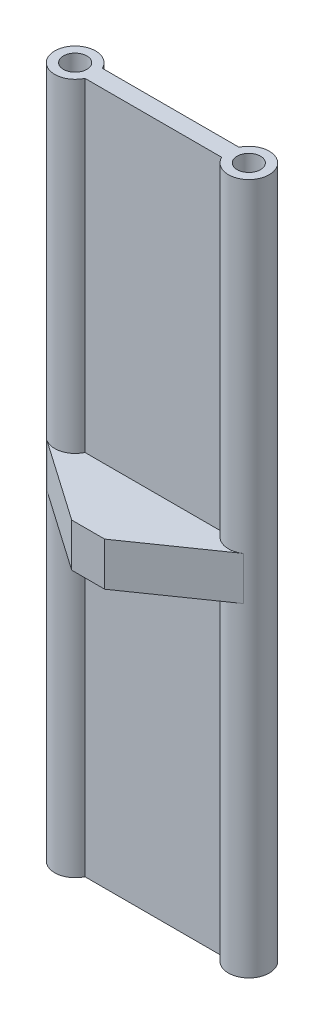
ISO-10303-21;
HEADER;
FILE_DESCRIPTION(('STEP AP214'),'2;1');
FILE_NAME('part.step','',(''),(''),'','','');
FILE_SCHEMA(('AUTOMOTIVE_DESIGN { 1 0 10303 214 1 1 1 1 }'));
ENDSEC;
DATA;
#1=APPLICATION_CONTEXT('core data for automotive mechanical design processes');
#2=APPLICATION_PROTOCOL_DEFINITION('international standard','automotive_design',2000,#1);
#3=PRODUCT_CONTEXT('',#1,'mechanical');
#4=PRODUCT('Part','Part','',(#3));
#5=PRODUCT_RELATED_PRODUCT_CATEGORY('part','',(#4));
#6=PRODUCT_DEFINITION_FORMATION('','',#4);
#7=PRODUCT_DEFINITION_CONTEXT('part definition',#1,'design');
#8=PRODUCT_DEFINITION('design','',#6,#7);
#9=PRODUCT_DEFINITION_SHAPE('','',#8);
#10=(LENGTH_UNIT() NAMED_UNIT(*) SI_UNIT(.MILLI.,.METRE.));
#11=(NAMED_UNIT(*) PLANE_ANGLE_UNIT() SI_UNIT($,.RADIAN.));
#12=(NAMED_UNIT(*) SI_UNIT($,.STERADIAN.) SOLID_ANGLE_UNIT());
#13=UNCERTAINTY_MEASURE_WITH_UNIT(LENGTH_MEASURE(1.E-05),#10,'distance_accuracy_value','');
#14=(GEOMETRIC_REPRESENTATION_CONTEXT(3) GLOBAL_UNCERTAINTY_ASSIGNED_CONTEXT((#13)) GLOBAL_UNIT_ASSIGNED_CONTEXT((#10,
#11,#12)) REPRESENTATION_CONTEXT('',''));
#15=CARTESIAN_POINT('',(0.,0.,0.));
#16=DIRECTION('',(0.,0.,1.));
#17=DIRECTION('',(1.,0.,0.));
#18=AXIS2_PLACEMENT_3D('',#15,#16,#17);
#19=CARTESIAN_POINT('',(19.9983927391933,202.2602,2.54));
#20=DIRECTION('',(0.,0.,-1.));
#21=DIRECTION('',(-1.,0.,0.));
#22=AXIS2_PLACEMENT_3D('',#19,#20,#21);
#23=PLANE('',#22);
#24=DIRECTION('',(-1.,0.,0.));
#25=VECTOR('',#24,1.);
#26=CARTESIAN_POINT('',(-19.9983927391933,94.7801,2.54));
#27=LINE('',#26,#25);
#28=CARTESIAN_POINT('',(19.9983927391933,94.7801,2.54));
#29=VERTEX_POINT('',#28);
#30=CARTESIAN_POINT('',(-19.9983927391933,94.7801,2.54));
#31=VERTEX_POINT('',#30);
#32=EDGE_CURVE('E151',#29,#31,#27,.T.);
#33=ORIENTED_EDGE('',*,*,#32,.T.);
#34=DIRECTION('',(0.,-1.,0.));
#35=VECTOR('',#34,1.);
#36=CARTESIAN_POINT('',(-19.9983927391933,202.2602,2.54));
#37=LINE('',#36,#35);
#38=CARTESIAN_POINT('',(-19.9983927391933,0.,2.54));
#39=VERTEX_POINT('',#38);
#40=EDGE_CURVE('E273',#31,#39,#37,.T.);
#41=ORIENTED_EDGE('',*,*,#40,.T.);
#42=DIRECTION('',(1.,0.,0.));
#43=VECTOR('',#42,1.);
#44=CARTESIAN_POINT('',(19.9983927391933,0.,2.54));
#45=LINE('',#44,#43);
#46=CARTESIAN_POINT('',(19.9983927391933,0.,2.54));
#47=VERTEX_POINT('',#46);
#48=EDGE_CURVE('E154',#39,#47,#45,.T.);
#49=ORIENTED_EDGE('',*,*,#48,.T.);
#50=DIRECTION('',(0.,-1.,0.));
#51=VECTOR('',#50,1.);
#52=CARTESIAN_POINT('',(19.9983927391933,202.2602,2.54));
#53=LINE('',#52,#51);
#54=EDGE_CURVE('E149',#29,#47,#53,.T.);
#55=ORIENTED_EDGE('',*,*,#54,.F.);
#56=EDGE_LOOP('',(#33,#41,#49,#55));
#57=FACE_BOUND('',#56,.T.);
#58=ADVANCED_FACE('F37',(#57),#23,.F.);
#59=CARTESIAN_POINT('',(19.9983927391933,202.2602,-2.54));
#60=DIRECTION('',(0.,0.,1.));
#61=DIRECTION('',(1.,0.,0.));
#62=AXIS2_PLACEMENT_3D('',#59,#60,#61);
#63=PLANE('',#62);
#64=DIRECTION('',(1.,0.,0.));
#65=VECTOR('',#64,1.);
#66=CARTESIAN_POINT('',(19.9983927391933,94.7801,-2.54));
#67=LINE('',#66,#65);
#68=CARTESIAN_POINT('',(-19.9983927391933,94.7801,-2.54));
#69=VERTEX_POINT('',#68);
#70=CARTESIAN_POINT('',(19.9983927391933,94.7801,-2.54));
#71=VERTEX_POINT('',#70);
#72=EDGE_CURVE('E209',#69,#71,#67,.T.);
#73=ORIENTED_EDGE('',*,*,#72,.T.);
#74=DIRECTION('',(0.,-1.,0.));
#75=VECTOR('',#74,1.);
#76=CARTESIAN_POINT('',(19.9983927391933,202.2602,-2.54));
#77=LINE('',#76,#75);
#78=CARTESIAN_POINT('',(19.9983927391933,0.,-2.54));
#79=VERTEX_POINT('',#78);
#80=EDGE_CURVE('E45',#71,#79,#77,.T.);
#81=ORIENTED_EDGE('',*,*,#80,.T.);
#82=DIRECTION('',(-1.,0.,0.));
#83=VECTOR('',#82,1.);
#84=CARTESIAN_POINT('',(19.9983927391933,0.,-2.54));
#85=LINE('',#84,#83);
#86=CARTESIAN_POINT('',(-19.9983927391933,0.,-2.54));
#87=VERTEX_POINT('',#86);
#88=EDGE_CURVE('E266',#79,#87,#85,.T.);
#89=ORIENTED_EDGE('',*,*,#88,.T.);
#90=DIRECTION('',(0.,-1.,0.));
#91=VECTOR('',#90,1.);
#92=CARTESIAN_POINT('',(-19.9983927391933,202.2602,-2.54));
#93=LINE('',#92,#91);
#94=EDGE_CURVE('E276',#69,#87,#93,.T.);
#95=ORIENTED_EDGE('',*,*,#94,.F.);
#96=EDGE_LOOP('',(#73,#81,#89,#95));
#97=FACE_BOUND('',#96,.T.);
#98=ADVANCED_FACE('F289',(#97),#63,.F.);
#99=CARTESIAN_POINT('',(25.4,202.2602,0.));
#100=DIRECTION('',(0.,1.,0.));
#101=DIRECTION('',(0.,0.,1.));
#102=AXIS2_PLACEMENT_3D('',#99,#100,#101);
#103=PLANE('',#102);
#104=CARTESIAN_POINT('',(-25.4,202.2602,0.));
#105=DIRECTION('',(0.,1.,0.));
#106=DIRECTION('',(0.,0.,1.));
#107=AXIS2_PLACEMENT_3D('',#104,#105,#106);
#108=CIRCLE('',#107,3.429);
#109=CARTESIAN_POINT('',(-25.4,202.2602,3.42900000000001));
#110=VERTEX_POINT('',#109);
#111=EDGE_CURVE('E251',#110,#110,#108,.T.);
#112=ORIENTED_EDGE('',*,*,#111,.F.);
#113=EDGE_LOOP('',(#112));
#114=FACE_BOUND('',#113,.T.);
#115=CARTESIAN_POINT('',(25.4,202.2602,0.));
#116=DIRECTION('',(0.,1.,0.));
#117=DIRECTION('',(0.,0.,1.));
#118=AXIS2_PLACEMENT_3D('',#115,#116,#117);
#119=CIRCLE('',#118,5.969);
#120=CARTESIAN_POINT('',(19.9983927391933,202.2602,2.54));
#121=VERTEX_POINT('',#120);
#122=CARTESIAN_POINT('',(19.9983927391933,202.2602,-2.54));
#123=VERTEX_POINT('',#122);
#124=EDGE_CURVE('E257',#121,#123,#119,.T.);
#125=ORIENTED_EDGE('',*,*,#124,.T.);
#126=DIRECTION('',(-1.,0.,0.));
#127=VECTOR('',#126,1.);
#128=CARTESIAN_POINT('',(19.9983927391933,202.2602,-2.54));
#129=LINE('',#128,#127);
#130=CARTESIAN_POINT('',(-19.9983927391933,202.2602,-2.54));
#131=VERTEX_POINT('',#130);
#132=EDGE_CURVE('E260',#123,#131,#129,.T.);
#133=ORIENTED_EDGE('',*,*,#132,.T.);
#134=CARTESIAN_POINT('',(-25.4,202.2602,0.));
#135=DIRECTION('',(0.,1.,0.));
#136=DIRECTION('',(0.,0.,1.));
#137=AXIS2_PLACEMENT_3D('',#134,#135,#136);
#138=CIRCLE('',#137,5.969);
#139=CARTESIAN_POINT('',(-19.9983927391933,202.2602,2.54));
#140=VERTEX_POINT('',#139);
#141=EDGE_CURVE('E262',#131,#140,#138,.T.);
#142=ORIENTED_EDGE('',*,*,#141,.T.);
#143=DIRECTION('',(1.,0.,0.));
#144=VECTOR('',#143,1.);
#145=CARTESIAN_POINT('',(19.9983927391933,202.2602,2.54));
#146=LINE('',#145,#144);
#147=EDGE_CURVE('E158',#140,#121,#146,.T.);
#148=ORIENTED_EDGE('',*,*,#147,.T.);
#149=EDGE_LOOP('',(#125,#133,#142,#148));
#150=FACE_BOUND('',#149,.T.);
#151=CARTESIAN_POINT('',(25.4,202.2602,0.));
#152=DIRECTION('',(0.,1.,0.));
#153=DIRECTION('',(0.,0.,1.));
#154=AXIS2_PLACEMENT_3D('',#151,#152,#153);
#155=CIRCLE('',#154,3.429);
#156=CARTESIAN_POINT('',(25.4,202.2602,3.42900000000001));
#157=VERTEX_POINT('',#156);
#158=EDGE_CURVE('E245',#157,#157,#155,.T.);
#159=ORIENTED_EDGE('',*,*,#158,.F.);
#160=EDGE_LOOP('',(#159));
#161=FACE_BOUND('',#160,.T.);
#162=ADVANCED_FACE('F335',(#114,#150,#161),#103,.T.);
#163=CARTESIAN_POINT('',(25.4,0.,0.));
#164=DIRECTION('',(0.,1.,0.));
#165=DIRECTION('',(0.,0.,1.));
#166=AXIS2_PLACEMENT_3D('',#163,#164,#165);
#167=PLANE('',#166);
#168=CARTESIAN_POINT('',(25.4,0.,0.));
#169=DIRECTION('',(0.,1.,0.));
#170=DIRECTION('',(0.,0.,1.));
#171=AXIS2_PLACEMENT_3D('',#168,#169,#170);
#172=CIRCLE('',#171,5.969);
#173=EDGE_CURVE('E254',#47,#79,#172,.T.);
#174=ORIENTED_EDGE('',*,*,#173,.F.);
#175=ORIENTED_EDGE('',*,*,#48,.F.);
#176=CARTESIAN_POINT('',(-25.4,0.,0.));
#177=DIRECTION('',(0.,1.,0.));
#178=DIRECTION('',(0.,0.,1.));
#179=AXIS2_PLACEMENT_3D('',#176,#177,#178);
#180=CIRCLE('',#179,5.969);
#181=EDGE_CURVE('E269',#87,#39,#180,.T.);
#182=ORIENTED_EDGE('',*,*,#181,.F.);
#183=ORIENTED_EDGE('',*,*,#88,.F.);
#184=EDGE_LOOP('',(#174,#175,#182,#183));
#185=FACE_BOUND('',#184,.T.);
#186=CARTESIAN_POINT('',(-25.4,0.,0.));
#187=DIRECTION('',(0.,1.,0.));
#188=DIRECTION('',(0.,0.,1.));
#189=AXIS2_PLACEMENT_3D('',#186,#187,#188);
#190=CIRCLE('',#189,3.429);
#191=CARTESIAN_POINT('',(-25.4,0.,3.42900000000001));
#192=VERTEX_POINT('',#191);
#193=EDGE_CURVE('E248',#192,#192,#190,.T.);
#194=ORIENTED_EDGE('',*,*,#193,.T.);
#195=EDGE_LOOP('',(#194));
#196=FACE_BOUND('',#195,.T.);
#197=CARTESIAN_POINT('',(25.4,0.,0.));
#198=DIRECTION('',(0.,1.,0.));
#199=DIRECTION('',(0.,0.,1.));
#200=AXIS2_PLACEMENT_3D('',#197,#198,#199);
#201=CIRCLE('',#200,3.429);
#202=CARTESIAN_POINT('',(25.4,0.,3.42900000000001));
#203=VERTEX_POINT('',#202);
#204=EDGE_CURVE('E244',#203,#203,#201,.T.);
#205=ORIENTED_EDGE('',*,*,#204,.T.);
#206=EDGE_LOOP('',(#205));
#207=FACE_BOUND('',#206,.T.);
#208=ADVANCED_FACE('F292',(#185,#196,#207),#167,.F.);
#209=CARTESIAN_POINT('',(25.4,202.2602,0.));
#210=DIRECTION('',(0.,-1.,0.));
#211=DIRECTION('',(0.,0.,-1.));
#212=AXIS2_PLACEMENT_3D('',#209,#210,#211);
#213=CYLINDRICAL_SURFACE('',#212,5.969);
#214=CARTESIAN_POINT('',(19.9983927391933,107.4801,2.54));
#215=VERTEX_POINT('',#214);
#216=EDGE_CURVE('E157',#121,#215,#53,.T.);
#217=ORIENTED_EDGE('',*,*,#216,.T.);
#218=CARTESIAN_POINT('',(25.4,107.4801,0.));
#219=DIRECTION('',(0.,-1.,0.));
#220=DIRECTION('',(0.,0.,-1.));
#221=AXIS2_PLACEMENT_3D('',#218,#219,#220);
#222=CIRCLE('',#221,5.969);
#223=CARTESIAN_POINT('',(28.8095663889265,107.4801,4.89936914709464));
#224=VERTEX_POINT('',#223);
#225=EDGE_CURVE('E52',#224,#215,#222,.T.);
#226=ORIENTED_EDGE('',*,*,#225,.F.);
#227=DIRECTION('',(0.,-1.,0.));
#228=VECTOR('',#227,1.);
#229=CARTESIAN_POINT('',(28.8095663889265,107.4801,4.89936914709464));
#230=LINE('',#229,#228);
#231=CARTESIAN_POINT('',(28.8095663889265,94.7801,4.89936914709464));
#232=VERTEX_POINT('',#231);
#233=EDGE_CURVE('E56',#224,#232,#230,.T.);
#234=ORIENTED_EDGE('',*,*,#233,.T.);
#235=CARTESIAN_POINT('',(25.4,94.7801,0.));
#236=DIRECTION('',(0.,-1.,0.));
#237=DIRECTION('',(0.,0.,-1.));
#238=AXIS2_PLACEMENT_3D('',#235,#236,#237);
#239=CIRCLE('',#238,5.969);
#240=EDGE_CURVE('E160',#232,#29,#239,.T.);
#241=ORIENTED_EDGE('',*,*,#240,.T.);
#242=ORIENTED_EDGE('',*,*,#54,.T.);
#243=ORIENTED_EDGE('',*,*,#173,.T.);
#244=ORIENTED_EDGE('',*,*,#80,.F.);
#245=CARTESIAN_POINT('',(25.4,94.7801,0.));
#246=DIRECTION('',(0.,-1.,0.));
#247=DIRECTION('',(0.,0.,1.));
#248=AXIS2_PLACEMENT_3D('',#245,#246,#247);
#249=CIRCLE('',#248,5.969);
#250=CARTESIAN_POINT('',(28.8095663889265,94.7801,-4.89936914709464));
#251=VERTEX_POINT('',#250);
#252=EDGE_CURVE('E204',#71,#251,#249,.T.);
#253=ORIENTED_EDGE('',*,*,#252,.T.);
#254=DIRECTION('',(0.,-1.,0.));
#255=VECTOR('',#254,1.);
#256=CARTESIAN_POINT('',(28.8095663889265,107.4801,-4.89936914709464));
#257=LINE('',#256,#255);
#258=CARTESIAN_POINT('',(28.8095663889265,107.4801,-4.89936914709464));
#259=VERTEX_POINT('',#258);
#260=EDGE_CURVE('E241',#259,#251,#257,.T.);
#261=ORIENTED_EDGE('',*,*,#260,.F.);
#262=CARTESIAN_POINT('',(25.4,107.4801,0.));
#263=DIRECTION('',(0.,-1.,0.));
#264=DIRECTION('',(0.,0.,1.));
#265=AXIS2_PLACEMENT_3D('',#262,#263,#264);
#266=CIRCLE('',#265,5.969);
#267=CARTESIAN_POINT('',(19.9983927391933,107.4801,-2.54));
#268=VERTEX_POINT('',#267);
#269=EDGE_CURVE('E205',#268,#259,#266,.T.);
#270=ORIENTED_EDGE('',*,*,#269,.F.);
#271=EDGE_CURVE('E11',#123,#268,#77,.T.);
#272=ORIENTED_EDGE('',*,*,#271,.F.);
#273=ORIENTED_EDGE('',*,*,#124,.F.);
#274=EDGE_LOOP('',(#217,#226,#234,#241,#242,#243,#244,#253,#261,#270,#272,#273));
#275=FACE_BOUND('',#274,.T.);
#276=ADVANCED_FACE('F39',(#275),#213,.T.);
#277=ORIENTED_EDGE('',*,*,#271,.T.);
#278=DIRECTION('',(1.,0.,0.));
#279=VECTOR('',#278,1.);
#280=CARTESIAN_POINT('',(19.9983927391933,107.4801,-2.54));
#281=LINE('',#280,#279);
#282=CARTESIAN_POINT('',(-19.9983927391933,107.4801,-2.54));
#283=VERTEX_POINT('',#282);
#284=EDGE_CURVE('E219',#283,#268,#281,.T.);
#285=ORIENTED_EDGE('',*,*,#284,.F.);
#286=EDGE_CURVE('E277',#131,#283,#93,.T.);
#287=ORIENTED_EDGE('',*,*,#286,.F.);
#288=ORIENTED_EDGE('',*,*,#132,.F.);
#289=EDGE_LOOP('',(#277,#285,#287,#288));
#290=FACE_BOUND('',#289,.T.);
#291=ADVANCED_FACE('F308',(#290),#63,.F.);
#292=CARTESIAN_POINT('',(-25.4,202.2602,0.));
#293=DIRECTION('',(0.,-1.,0.));
#294=DIRECTION('',(0.,0.,-1.));
#295=AXIS2_PLACEMENT_3D('',#292,#293,#294);
#296=CYLINDRICAL_SURFACE('',#295,5.969);
#297=DIRECTION('',(0.,-1.,0.));
#298=VECTOR('',#297,1.);
#299=CARTESIAN_POINT('',(-28.8095663889265,107.4801,4.89936914709464));
#300=LINE('',#299,#298);
#301=CARTESIAN_POINT('',(-28.8095663889265,107.4801,4.89936914709464));
#302=VERTEX_POINT('',#301);
#303=CARTESIAN_POINT('',(-28.8095663889265,94.7801,4.89936914709464));
#304=VERTEX_POINT('',#303);
#305=EDGE_CURVE('E201',#302,#304,#300,.T.);
#306=ORIENTED_EDGE('',*,*,#305,.F.);
#307=CARTESIAN_POINT('',(-25.4,107.4801,0.));
#308=DIRECTION('',(0.,-1.,0.));
#309=DIRECTION('',(0.,0.,-1.));
#310=AXIS2_PLACEMENT_3D('',#307,#308,#309);
#311=CIRCLE('',#310,5.969);
#312=CARTESIAN_POINT('',(-19.9983927391933,107.4801,2.54));
#313=VERTEX_POINT('',#312);
#314=EDGE_CURVE('E186',#313,#302,#311,.T.);
#315=ORIENTED_EDGE('',*,*,#314,.F.);
#316=EDGE_CURVE('E274',#140,#313,#37,.T.);
#317=ORIENTED_EDGE('',*,*,#316,.F.);
#318=ORIENTED_EDGE('',*,*,#141,.F.);
#319=ORIENTED_EDGE('',*,*,#286,.T.);
#320=CARTESIAN_POINT('',(-25.4,107.4801,0.));
#321=DIRECTION('',(0.,-1.,0.));
#322=DIRECTION('',(0.,0.,1.));
#323=AXIS2_PLACEMENT_3D('',#320,#321,#322);
#324=CIRCLE('',#323,5.969);
#325=CARTESIAN_POINT('',(-28.8095663889265,107.4801,-4.89936914709464));
#326=VERTEX_POINT('',#325);
#327=EDGE_CURVE('E216',#326,#283,#324,.T.);
#328=ORIENTED_EDGE('',*,*,#327,.F.);
#329=DIRECTION('',(0.,-1.,0.));
#330=VECTOR('',#329,1.);
#331=CARTESIAN_POINT('',(-28.8095663889265,107.4801,-4.89936914709464));
#332=LINE('',#331,#330);
#333=CARTESIAN_POINT('',(-28.8095663889265,94.7801,-4.89936914709464));
#334=VERTEX_POINT('',#333);
#335=EDGE_CURVE('E222',#326,#334,#332,.T.);
#336=ORIENTED_EDGE('',*,*,#335,.T.);
#337=CARTESIAN_POINT('',(-25.4,94.7801,0.));
#338=DIRECTION('',(0.,-1.,0.));
#339=DIRECTION('',(0.,0.,1.));
#340=AXIS2_PLACEMENT_3D('',#337,#338,#339);
#341=CIRCLE('',#340,5.969);
#342=EDGE_CURVE('E231',#334,#69,#341,.T.);
#343=ORIENTED_EDGE('',*,*,#342,.T.);
#344=ORIENTED_EDGE('',*,*,#94,.T.);
#345=ORIENTED_EDGE('',*,*,#181,.T.);
#346=ORIENTED_EDGE('',*,*,#40,.F.);
#347=CARTESIAN_POINT('',(-25.4,94.7801,0.));
#348=DIRECTION('',(0.,-1.,0.));
#349=DIRECTION('',(0.,0.,-1.));
#350=AXIS2_PLACEMENT_3D('',#347,#348,#349);
#351=CIRCLE('',#350,5.969);
#352=EDGE_CURVE('E168',#31,#304,#351,.T.);
#353=ORIENTED_EDGE('',*,*,#352,.T.);
#354=EDGE_LOOP('',(#306,#315,#317,#318,#319,#328,#336,#343,#344,#345,#346,#353));
#355=FACE_BOUND('',#354,.T.);
#356=ADVANCED_FACE('F283',(#355),#296,.T.);
#357=ORIENTED_EDGE('',*,*,#316,.T.);
#358=DIRECTION('',(-1.,0.,0.));
#359=VECTOR('',#358,1.);
#360=CARTESIAN_POINT('',(-19.9983927391933,107.4801,2.54));
#361=LINE('',#360,#359);
#362=EDGE_CURVE('E195',#215,#313,#361,.T.);
#363=ORIENTED_EDGE('',*,*,#362,.F.);
#364=ORIENTED_EDGE('',*,*,#216,.F.);
#365=ORIENTED_EDGE('',*,*,#147,.F.);
#366=EDGE_LOOP('',(#357,#363,#364,#365));
#367=FACE_BOUND('',#366,.T.);
#368=ADVANCED_FACE('F329',(#367),#23,.F.);
#369=CARTESIAN_POINT('',(-25.4,202.2602,0.));
#370=DIRECTION('',(0.,-1.,0.));
#371=DIRECTION('',(0.,0.,-1.));
#372=AXIS2_PLACEMENT_3D('',#369,#370,#371);
#373=CYLINDRICAL_SURFACE('',#372,3.429);
#374=ORIENTED_EDGE('',*,*,#111,.T.);
#375=EDGE_LOOP('',(#374));
#376=FACE_BOUND('',#375,.T.);
#377=ORIENTED_EDGE('',*,*,#193,.F.);
#378=EDGE_LOOP('',(#377));
#379=FACE_BOUND('',#378,.T.);
#380=ADVANCED_FACE('F339',(#376,#379),#373,.F.);
#381=CARTESIAN_POINT('',(25.4,202.2602,0.));
#382=DIRECTION('',(0.,-1.,0.));
#383=DIRECTION('',(0.,0.,-1.));
#384=AXIS2_PLACEMENT_3D('',#381,#382,#383);
#385=CYLINDRICAL_SURFACE('',#384,3.429);
#386=ORIENTED_EDGE('',*,*,#158,.T.);
#387=EDGE_LOOP('',(#386));
#388=FACE_BOUND('',#387,.T.);
#389=ORIENTED_EDGE('',*,*,#204,.F.);
#390=EDGE_LOOP('',(#389));
#391=FACE_BOUND('',#390,.T.);
#392=ADVANCED_FACE('F325',(#388,#391),#385,.F.);
#393=CARTESIAN_POINT('',(28.8095663889265,107.4801,-4.89936914709464));
#394=DIRECTION('',(-0.571212328518425,0.,0.820802336588146));
#395=DIRECTION('',(0.820802336588146,0.,0.571212328518425));
#396=AXIS2_PLACEMENT_3D('',#393,#394,#395);
#397=PLANE('',#396);
#398=DIRECTION('',(-0.820802336588146,0.,-0.571212328518425));
#399=VECTOR('',#398,1.);
#400=CARTESIAN_POINT('',(28.8095663889265,94.7801,-4.89936914709464));
#401=LINE('',#400,#399);
#402=CARTESIAN_POINT('',(4.826,94.7801,-21.59));
#403=VERTEX_POINT('',#402);
#404=EDGE_CURVE('E224',#251,#403,#401,.T.);
#405=ORIENTED_EDGE('',*,*,#404,.T.);
#406=DIRECTION('',(0.,-1.,0.));
#407=VECTOR('',#406,1.);
#408=CARTESIAN_POINT('',(4.826,107.4801,-21.59));
#409=LINE('',#408,#407);
#410=CARTESIAN_POINT('',(4.826,107.4801,-21.59));
#411=VERTEX_POINT('',#410);
#412=EDGE_CURVE('E238',#411,#403,#409,.T.);
#413=ORIENTED_EDGE('',*,*,#412,.F.);
#414=DIRECTION('',(-0.820802336588146,0.,-0.571212328518425));
#415=VECTOR('',#414,1.);
#416=CARTESIAN_POINT('',(28.8095663889265,107.4801,-4.89936914709464));
#417=LINE('',#416,#415);
#418=EDGE_CURVE('E208',#259,#411,#417,.T.);
#419=ORIENTED_EDGE('',*,*,#418,.F.);
#420=ORIENTED_EDGE('',*,*,#260,.T.);
#421=EDGE_LOOP('',(#405,#413,#419,#420));
#422=FACE_BOUND('',#421,.T.);
#423=ADVANCED_FACE('F303',(#422),#397,.F.);
#424=CARTESIAN_POINT('',(-4.826,107.4801,-21.59));
#425=DIRECTION('',(0.,0.,1.));
#426=DIRECTION('',(1.,0.,0.));
#427=AXIS2_PLACEMENT_3D('',#424,#425,#426);
#428=PLANE('',#427);
#429=DIRECTION('',(-1.,0.,0.));
#430=VECTOR('',#429,1.);
#431=CARTESIAN_POINT('',(-4.826,94.7801,-21.59));
#432=LINE('',#431,#430);
#433=CARTESIAN_POINT('',(-4.826,94.7801,-21.59));
#434=VERTEX_POINT('',#433);
#435=EDGE_CURVE('E226',#403,#434,#432,.T.);
#436=ORIENTED_EDGE('',*,*,#435,.T.);
#437=DIRECTION('',(0.,-1.,0.));
#438=VECTOR('',#437,1.);
#439=CARTESIAN_POINT('',(-4.826,107.4801,-21.59));
#440=LINE('',#439,#438);
#441=CARTESIAN_POINT('',(-4.826,107.4801,-21.59));
#442=VERTEX_POINT('',#441);
#443=EDGE_CURVE('E235',#442,#434,#440,.T.);
#444=ORIENTED_EDGE('',*,*,#443,.F.);
#445=DIRECTION('',(-1.,0.,0.));
#446=VECTOR('',#445,1.);
#447=CARTESIAN_POINT('',(-4.826,107.4801,-21.59));
#448=LINE('',#447,#446);
#449=EDGE_CURVE('E211',#411,#442,#448,.T.);
#450=ORIENTED_EDGE('',*,*,#449,.F.);
#451=ORIENTED_EDGE('',*,*,#412,.T.);
#452=EDGE_LOOP('',(#436,#444,#450,#451));
#453=FACE_BOUND('',#452,.T.);
#454=ADVANCED_FACE('F317',(#453),#428,.F.);
#455=CARTESIAN_POINT('',(-28.8095663889265,107.4801,-4.89936914709464));
#456=DIRECTION('',(0.571212328518425,0.,0.820802336588146));
#457=DIRECTION('',(0.820802336588146,0.,-0.571212328518425));
#458=AXIS2_PLACEMENT_3D('',#455,#456,#457);
#459=PLANE('',#458);
#460=DIRECTION('',(-0.820802336588146,0.,0.571212328518425));
#461=VECTOR('',#460,1.);
#462=CARTESIAN_POINT('',(-28.8095663889265,94.7801,-4.89936914709464));
#463=LINE('',#462,#461);
#464=EDGE_CURVE('E228',#434,#334,#463,.T.);
#465=ORIENTED_EDGE('',*,*,#464,.T.);
#466=ORIENTED_EDGE('',*,*,#335,.F.);
#467=DIRECTION('',(-0.820802336588146,0.,0.571212328518425));
#468=VECTOR('',#467,1.);
#469=CARTESIAN_POINT('',(-28.8095663889265,107.4801,-4.89936914709464));
#470=LINE('',#469,#468);
#471=EDGE_CURVE('E213',#442,#326,#470,.T.);
#472=ORIENTED_EDGE('',*,*,#471,.F.);
#473=ORIENTED_EDGE('',*,*,#443,.T.);
#474=EDGE_LOOP('',(#465,#466,#472,#473));
#475=FACE_BOUND('',#474,.T.);
#476=ADVANCED_FACE('F313',(#475),#459,.F.);
#477=CARTESIAN_POINT('',(25.4,107.4801,0.));
#478=DIRECTION('',(0.,1.,0.));
#479=DIRECTION('',(0.,0.,1.));
#480=AXIS2_PLACEMENT_3D('',#477,#478,#479);
#481=PLANE('',#480);
#482=ORIENTED_EDGE('',*,*,#269,.T.);
#483=ORIENTED_EDGE('',*,*,#418,.T.);
#484=ORIENTED_EDGE('',*,*,#449,.T.);
#485=ORIENTED_EDGE('',*,*,#471,.T.);
#486=ORIENTED_EDGE('',*,*,#327,.T.);
#487=ORIENTED_EDGE('',*,*,#284,.T.);
#488=EDGE_LOOP('',(#482,#483,#484,#485,#486,#487));
#489=FACE_BOUND('',#488,.T.);
#490=ADVANCED_FACE('F309',(#489),#481,.T.);
#491=CARTESIAN_POINT('',(25.4,94.7801,0.));
#492=DIRECTION('',(0.,1.,0.));
#493=DIRECTION('',(0.,0.,1.));
#494=AXIS2_PLACEMENT_3D('',#491,#492,#493);
#495=PLANE('',#494);
#496=ORIENTED_EDGE('',*,*,#252,.F.);
#497=ORIENTED_EDGE('',*,*,#72,.F.);
#498=ORIENTED_EDGE('',*,*,#342,.F.);
#499=ORIENTED_EDGE('',*,*,#464,.F.);
#500=ORIENTED_EDGE('',*,*,#435,.F.);
#501=ORIENTED_EDGE('',*,*,#404,.F.);
#502=EDGE_LOOP('',(#496,#497,#498,#499,#500,#501));
#503=FACE_BOUND('',#502,.T.);
#504=ADVANCED_FACE('F297',(#503),#495,.F.);
#505=CARTESIAN_POINT('',(-28.8095663889265,107.4801,4.89936914709464));
#506=DIRECTION('',(0.571212328518425,0.,-0.820802336588146));
#507=DIRECTION('',(-0.820802336588146,0.,-0.571212328518425));
#508=AXIS2_PLACEMENT_3D('',#505,#506,#507);
#509=PLANE('',#508);
#510=DIRECTION('',(0.820802336588146,0.,0.571212328518425));
#511=VECTOR('',#510,1.);
#512=CARTESIAN_POINT('',(-28.8095663889265,94.7801,4.89936914709464));
#513=LINE('',#512,#511);
#514=CARTESIAN_POINT('',(-4.826,94.7801,21.59));
#515=VERTEX_POINT('',#514);
#516=EDGE_CURVE('E176',#304,#515,#513,.T.);
#517=ORIENTED_EDGE('',*,*,#516,.T.);
#518=DIRECTION('',(0.,-1.,0.));
#519=VECTOR('',#518,1.);
#520=CARTESIAN_POINT('',(-4.826,107.4801,21.59));
#521=LINE('',#520,#519);
#522=CARTESIAN_POINT('',(-4.826,107.4801,21.59));
#523=VERTEX_POINT('',#522);
#524=EDGE_CURVE('E198',#523,#515,#521,.T.);
#525=ORIENTED_EDGE('',*,*,#524,.F.);
#526=DIRECTION('',(0.820802336588146,0.,0.571212328518425));
#527=VECTOR('',#526,1.);
#528=CARTESIAN_POINT('',(-28.8095663889265,107.4801,4.89936914709464));
#529=LINE('',#528,#527);
#530=EDGE_CURVE('E189',#302,#523,#529,.T.);
#531=ORIENTED_EDGE('',*,*,#530,.F.);
#532=ORIENTED_EDGE('',*,*,#305,.T.);
#533=EDGE_LOOP('',(#517,#525,#531,#532));
#534=FACE_BOUND('',#533,.T.);
#535=ADVANCED_FACE('F362',(#534),#509,.F.);
#536=CARTESIAN_POINT('',(4.826,107.4801,21.59));
#537=DIRECTION('',(0.,0.,-1.));
#538=DIRECTION('',(-1.,0.,0.));
#539=AXIS2_PLACEMENT_3D('',#536,#537,#538);
#540=PLANE('',#539);
#541=DIRECTION('',(1.,0.,0.));
#542=VECTOR('',#541,1.);
#543=CARTESIAN_POINT('',(4.826,94.7801,21.59));
#544=LINE('',#543,#542);
#545=CARTESIAN_POINT('',(4.826,94.7801,21.59));
#546=VERTEX_POINT('',#545);
#547=EDGE_CURVE('E173',#515,#546,#544,.T.);
#548=ORIENTED_EDGE('',*,*,#547,.T.);
#549=DIRECTION('',(0.,-1.,0.));
#550=VECTOR('',#549,1.);
#551=CARTESIAN_POINT('',(4.826,107.4801,21.59));
#552=LINE('',#551,#550);
#553=CARTESIAN_POINT('',(4.826,107.4801,21.59));
#554=VERTEX_POINT('',#553);
#555=EDGE_CURVE('E183',#554,#546,#552,.T.);
#556=ORIENTED_EDGE('',*,*,#555,.F.);
#557=DIRECTION('',(1.,0.,0.));
#558=VECTOR('',#557,1.);
#559=CARTESIAN_POINT('',(4.826,107.4801,21.59));
#560=LINE('',#559,#558);
#561=EDGE_CURVE('E191',#523,#554,#560,.T.);
#562=ORIENTED_EDGE('',*,*,#561,.F.);
#563=ORIENTED_EDGE('',*,*,#524,.T.);
#564=EDGE_LOOP('',(#548,#556,#562,#563));
#565=FACE_BOUND('',#564,.T.);
#566=ADVANCED_FACE('F359',(#565),#540,.F.);
#567=CARTESIAN_POINT('',(-25.4,107.4801,0.));
#568=DIRECTION('',(0.,1.,0.));
#569=DIRECTION('',(0.,0.,-1.));
#570=AXIS2_PLACEMENT_3D('',#567,#568,#569);
#571=PLANE('',#570);
#572=ORIENTED_EDGE('',*,*,#314,.T.);
#573=ORIENTED_EDGE('',*,*,#530,.T.);
#574=ORIENTED_EDGE('',*,*,#561,.T.);
#575=DIRECTION('',(0.820802336588146,0.,-0.571212328518425));
#576=VECTOR('',#575,1.);
#577=CARTESIAN_POINT('',(28.8095663889265,107.4801,4.89936914709464));
#578=LINE('',#577,#576);
#579=EDGE_CURVE('E180',#554,#224,#578,.T.);
#580=ORIENTED_EDGE('',*,*,#579,.T.);
#581=ORIENTED_EDGE('',*,*,#225,.T.);
#582=ORIENTED_EDGE('',*,*,#362,.T.);
#583=EDGE_LOOP('',(#572,#573,#574,#580,#581,#582));
#584=FACE_BOUND('',#583,.T.);
#585=ADVANCED_FACE('F352',(#584),#571,.T.);
#586=CARTESIAN_POINT('',(28.8095663889265,107.4801,4.89936914709464));
#587=DIRECTION('',(-0.571212328518425,0.,-0.820802336588146));
#588=DIRECTION('',(-0.820802336588146,0.,0.571212328518425));
#589=AXIS2_PLACEMENT_3D('',#586,#587,#588);
#590=PLANE('',#589);
#591=DIRECTION('',(0.820802336588146,0.,-0.571212328518425));
#592=VECTOR('',#591,1.);
#593=CARTESIAN_POINT('',(28.8095663889265,94.7801,4.89936914709464));
#594=LINE('',#593,#592);
#595=EDGE_CURVE('E163',#546,#232,#594,.T.);
#596=ORIENTED_EDGE('',*,*,#595,.T.);
#597=ORIENTED_EDGE('',*,*,#233,.F.);
#598=ORIENTED_EDGE('',*,*,#579,.F.);
#599=ORIENTED_EDGE('',*,*,#555,.T.);
#600=EDGE_LOOP('',(#596,#597,#598,#599));
#601=FACE_BOUND('',#600,.T.);
#602=ADVANCED_FACE('F357',(#601),#590,.F.);
#603=CARTESIAN_POINT('',(-25.4,94.7801,0.));
#604=DIRECTION('',(0.,1.,0.));
#605=DIRECTION('',(0.,0.,-1.));
#606=AXIS2_PLACEMENT_3D('',#603,#604,#605);
#607=PLANE('',#606);
#608=ORIENTED_EDGE('',*,*,#352,.F.);
#609=ORIENTED_EDGE('',*,*,#32,.F.);
#610=ORIENTED_EDGE('',*,*,#240,.F.);
#611=ORIENTED_EDGE('',*,*,#595,.F.);
#612=ORIENTED_EDGE('',*,*,#547,.F.);
#613=ORIENTED_EDGE('',*,*,#516,.F.);
#614=EDGE_LOOP('',(#608,#609,#610,#611,#612,#613));
#615=FACE_BOUND('',#614,.T.);
#616=ADVANCED_FACE('F166',(#615),#607,.F.);
#617=CLOSED_SHELL('',(#58,#98,#162,#208,#276,#291,#356,#368,#380,#392,#423,#454,#476,#490,#504,
#535,#566,#585,#602,#616));
#618=MANIFOLD_SOLID_BREP('B2',#617);
#619=ADVANCED_BREP_SHAPE_REPRESENTATION('',(#18,#618),#14);
#620=SHAPE_DEFINITION_REPRESENTATION(#9,#619);
ENDSEC;
END-ISO-10303-21;
